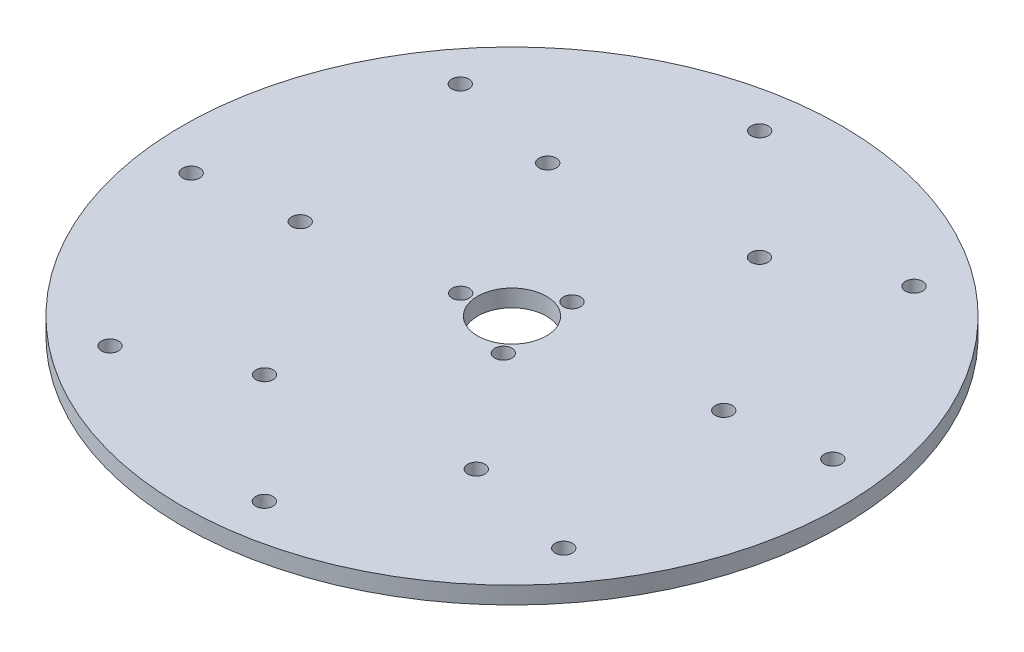
ISO-10303-21;
HEADER;
FILE_DESCRIPTION(('STEP AP214'),'2;1');
FILE_NAME('part.step','',(''),(''),'','','');
FILE_SCHEMA(('AUTOMOTIVE_DESIGN { 1 0 10303 214 1 1 1 1 }'));
ENDSEC;
DATA;
#1=APPLICATION_CONTEXT('core data for automotive mechanical design processes');
#2=APPLICATION_PROTOCOL_DEFINITION('international standard','automotive_design',2000,#1);
#3=PRODUCT_CONTEXT('',#1,'mechanical');
#4=PRODUCT('Part','Part','',(#3));
#5=PRODUCT_RELATED_PRODUCT_CATEGORY('part','',(#4));
#6=PRODUCT_DEFINITION_FORMATION('','',#4);
#7=PRODUCT_DEFINITION_CONTEXT('part definition',#1,'design');
#8=PRODUCT_DEFINITION('design','',#6,#7);
#9=PRODUCT_DEFINITION_SHAPE('','',#8);
#10=(LENGTH_UNIT() NAMED_UNIT(*) SI_UNIT(.MILLI.,.METRE.));
#11=(NAMED_UNIT(*) PLANE_ANGLE_UNIT() SI_UNIT($,.RADIAN.));
#12=(NAMED_UNIT(*) SI_UNIT($,.STERADIAN.) SOLID_ANGLE_UNIT());
#13=UNCERTAINTY_MEASURE_WITH_UNIT(LENGTH_MEASURE(1.E-05),#10,'distance_accuracy_value','');
#14=(GEOMETRIC_REPRESENTATION_CONTEXT(3) GLOBAL_UNCERTAINTY_ASSIGNED_CONTEXT((#13)) GLOBAL_UNIT_ASSIGNED_CONTEXT((#10,
#11,#12)) REPRESENTATION_CONTEXT('',''));
#15=CARTESIAN_POINT('',(0.,0.,0.));
#16=DIRECTION('',(0.,0.,1.));
#17=DIRECTION('',(1.,0.,0.));
#18=AXIS2_PLACEMENT_3D('',#15,#16,#17);
#19=CARTESIAN_POINT('',(0.,-97.,-2.63280363448266E-13));
#20=DIRECTION('',(0.,1.,0.));
#21=DIRECTION('',(0.991821591033947,0.,-0.127632016198486));
#22=AXIS2_PLACEMENT_3D('',#19,#20,#21);
#23=CYLINDRICAL_SURFACE('',#22,57.5);
#24=CARTESIAN_POINT('',(0.,-98.,-2.62205945253459E-13));
#25=DIRECTION('',(0.,-1.,0.));
#26=DIRECTION('',(-0.991821591033947,0.,0.127632016198486));
#27=AXIS2_PLACEMENT_3D('',#24,#25,#26);
#28=CIRCLE('',#27,57.5);
#29=CARTESIAN_POINT('',(-7.33884093141287,-98.0000000000001,-57.0297414844522));
#30=VERTEX_POINT('',#29);
#31=EDGE_CURVE('E56',#30,#30,#28,.T.);
#32=ORIENTED_EDGE('',*,*,#31,.F.);
#33=EDGE_LOOP('',(#32));
#34=FACE_BOUND('',#33,.T.);
#35=CARTESIAN_POINT('',(0.,-95.,-2.65429199837879E-13));
#36=DIRECTION('',(0.,-1.,0.));
#37=DIRECTION('',(-0.127632016198486,0.,-0.991821591033947));
#38=AXIS2_PLACEMENT_3D('',#35,#36,#37);
#39=CIRCLE('',#38,57.5);
#40=CARTESIAN_POINT('',(-7.33884093141286,-95.0000000000001,-57.0297414844522));
#41=VERTEX_POINT('',#40);
#42=EDGE_CURVE('E11',#41,#41,#39,.T.);
#43=ORIENTED_EDGE('',*,*,#42,.T.);
#44=EDGE_LOOP('',(#43));
#45=FACE_BOUND('',#44,.T.);
#46=ADVANCED_FACE('F46',(#34,#45),#23,.T.);
#47=CARTESIAN_POINT('',(0.,-98.,-2.62205945253459E-13));
#48=DIRECTION('',(0.,-1.,0.));
#49=DIRECTION('',(-0.127632016198486,0.,-0.991821591033947));
#50=AXIS2_PLACEMENT_3D('',#47,#48,#49);
#51=PLANE('',#50);
#52=CARTESIAN_POINT('',(3.08302581722295,-98.,-7.38206961565259));
#53=DIRECTION('',(0.,1.,0.));
#54=DIRECTION('',(0.991821591033947,0.,-0.127632016198486));
#55=AXIS2_PLACEMENT_3D('',#52,#53,#54);
#56=CIRCLE('',#55,1.5);
#57=CARTESIAN_POINT('',(4.57075820377387,-98.,-7.57351763995032));
#58=VERTEX_POINT('',#57);
#59=EDGE_CURVE('E203',#58,#58,#56,.T.);
#60=ORIENTED_EDGE('',*,*,#59,.T.);
#61=EDGE_LOOP('',(#60));
#62=FACE_BOUND('',#61,.T.);
#63=CARTESIAN_POINT('',(4.85154691104881,-98.,6.36101348606417));
#64=DIRECTION('',(0.,1.,0.));
#65=DIRECTION('',(0.991821591033947,0.,-0.127632016198486));
#66=AXIS2_PLACEMENT_3D('',#63,#64,#65);
#67=CIRCLE('',#66,1.5);
#68=CARTESIAN_POINT('',(6.33927929759974,-98.,6.16956546176645));
#69=VERTEX_POINT('',#68);
#70=EDGE_CURVE('E335',#69,#69,#67,.T.);
#71=ORIENTED_EDGE('',*,*,#70,.T.);
#72=EDGE_LOOP('',(#71));
#73=FACE_BOUND('',#72,.T.);
#74=CARTESIAN_POINT('',(-7.93457272827148,-98.,1.02105612958763));
#75=DIRECTION('',(0.,1.,0.));
#76=DIRECTION('',(0.991821591033947,0.,-0.127632016198486));
#77=AXIS2_PLACEMENT_3D('',#74,#75,#76);
#78=CIRCLE('',#77,1.5);
#79=CARTESIAN_POINT('',(-6.44684034172056,-98.,0.829608105289899));
#80=VERTEX_POINT('',#79);
#81=EDGE_CURVE('E339',#80,#80,#78,.T.);
#82=ORIENTED_EDGE('',*,*,#81,.T.);
#83=EDGE_LOOP('',(#82));
#84=FACE_BOUND('',#83,.T.);
#85=CARTESIAN_POINT('',(32.7301125041203,-98.0000000000001,-4.21185653455031));
#86=DIRECTION('',(0.,-1.,0.));
#87=DIRECTION('',(-0.991821591033947,0.,0.127632016198486));
#88=AXIS2_PLACEMENT_3D('',#85,#86,#87);
#89=CIRCLE('',#88,1.5);
#90=CARTESIAN_POINT('',(31.2423801175694,-98.0000000000001,-4.02040851025258));
#91=VERTEX_POINT('',#90);
#92=EDGE_CURVE('E195',#91,#91,#89,.T.);
#93=ORIENTED_EDGE('',*,*,#92,.F.);
#94=EDGE_LOOP('',(#93));
#95=FACE_BOUND('',#94,.T.);
#96=CARTESIAN_POINT('',(0.,-98.,-2.62205945253459E-13));
#97=DIRECTION('',(0.,-1.,0.));
#98=DIRECTION('',(-0.991821591033947,0.,0.127632016198486));
#99=AXIS2_PLACEMENT_3D('',#96,#97,#98);
#100=CIRCLE('',#99,6.);
#101=CARTESIAN_POINT('',(-5.95092954620358,-98.,0.765792097190656));
#102=VERTEX_POINT('',#101);
#103=EDGE_CURVE('E204',#102,#102,#100,.T.);
#104=ORIENTED_EDGE('',*,*,#103,.F.);
#105=EDGE_LOOP('',(#104));
#106=FACE_BOUND('',#105,.T.);
#107=CARTESIAN_POINT('',(20.012631008076,-98.,26.2391806300156));
#108=DIRECTION('',(0.,-1.,0.));
#109=DIRECTION('',(-0.991821591033947,0.,0.127632016198486));
#110=AXIS2_PLACEMENT_3D('',#107,#108,#109);
#111=CIRCLE('',#110,1.5);
#112=CARTESIAN_POINT('',(18.5248986215251,-98.,26.4306286543133));
#113=VERTEX_POINT('',#112);
#114=EDGE_CURVE('E207',#113,#113,#111,.T.);
#115=ORIENTED_EDGE('',*,*,#114,.F.);
#116=EDGE_LOOP('',(#115));
#117=FACE_BOUND('',#116,.T.);
#118=CARTESIAN_POINT('',(-12.7174814960442,-98.,30.4510371645656));
#119=DIRECTION('',(0.,-1.,0.));
#120=DIRECTION('',(-0.991821591033947,0.,0.127632016198486));
#121=AXIS2_PLACEMENT_3D('',#118,#119,#120);
#122=CIRCLE('',#121,1.5);
#123=CARTESIAN_POINT('',(-14.2052138825951,-98.,30.6424851888633));
#124=VERTEX_POINT('',#123);
#125=EDGE_CURVE('E216',#124,#124,#122,.T.);
#126=ORIENTED_EDGE('',*,*,#125,.F.);
#127=EDGE_LOOP('',(#126));
#128=FACE_BOUND('',#127,.T.);
#129=CARTESIAN_POINT('',(-32.7301125041201,-98.,4.21185653454978));
#130=DIRECTION('',(0.,-1.,0.));
#131=DIRECTION('',(-0.991821591033947,0.,0.127632016198486));
#132=AXIS2_PLACEMENT_3D('',#129,#130,#131);
#133=CIRCLE('',#132,1.5);
#134=CARTESIAN_POINT('',(-34.2178448906711,-98.,4.40330455884751));
#135=VERTEX_POINT('',#134);
#136=EDGE_CURVE('E228',#135,#135,#133,.T.);
#137=ORIENTED_EDGE('',*,*,#136,.F.);
#138=EDGE_LOOP('',(#137));
#139=FACE_BOUND('',#138,.T.);
#140=CARTESIAN_POINT('',(-20.0126310080758,-98.,-26.2391806300161));
#141=DIRECTION('',(0.,-1.,0.));
#142=DIRECTION('',(-0.991821591033947,0.,0.127632016198486));
#143=AXIS2_PLACEMENT_3D('',#140,#141,#142);
#144=CIRCLE('',#143,1.50000000000015);
#145=CARTESIAN_POINT('',(-21.5003633946269,-98.,-26.0477326057183));
#146=VERTEX_POINT('',#145);
#147=EDGE_CURVE('E224',#146,#146,#144,.T.);
#148=ORIENTED_EDGE('',*,*,#147,.F.);
#149=EDGE_LOOP('',(#148));
#150=FACE_BOUND('',#149,.T.);
#151=CARTESIAN_POINT('',(12.7174814960444,-98.0000000000001,-30.4510371645661));
#152=DIRECTION('',(0.,-1.,0.));
#153=DIRECTION('',(-0.991821591033947,0.,0.127632016198486));
#154=AXIS2_PLACEMENT_3D('',#151,#152,#153);
#155=CIRCLE('',#154,1.50000000000008);
#156=CARTESIAN_POINT('',(11.2297491094934,-98.0000000000001,-30.2595891402684));
#157=VERTEX_POINT('',#156);
#158=EDGE_CURVE('E220',#157,#157,#155,.T.);
#159=ORIENTED_EDGE('',*,*,#158,.F.);
#160=EDGE_LOOP('',(#159));
#161=FACE_BOUND('',#160,.T.);
#162=CARTESIAN_POINT('',(30.5537154298437,-98.0000000000001,-39.5786618448899));
#163=DIRECTION('',(0.,-1.,0.));
#164=DIRECTION('',(-0.991821591033947,0.,0.127632016198486));
#165=AXIS2_PLACEMENT_3D('',#162,#163,#164);
#166=CIRCLE('',#165,1.50000000000008);
#167=CARTESIAN_POINT('',(29.0659830432927,-98.0000000000001,-39.3872138205922));
#168=VERTEX_POINT('',#167);
#169=EDGE_CURVE('E153',#168,#168,#166,.T.);
#170=ORIENTED_EDGE('',*,*,#169,.F.);
#171=EDGE_LOOP('',(#170));
#172=FACE_BOUND('',#171,.T.);
#173=CARTESIAN_POINT('',(-6.3816008099242,-98.0000000000001,-49.5910795516975));
#174=DIRECTION('',(0.,-1.,0.));
#175=DIRECTION('',(-0.991821591033947,0.,0.127632016198486));
#176=AXIS2_PLACEMENT_3D('',#173,#174,#175);
#177=CIRCLE('',#176,1.50000000000017);
#178=CARTESIAN_POINT('',(-7.86933319647529,-98.0000000000001,-49.3996315273997));
#179=VERTEX_POINT('',#178);
#180=EDGE_CURVE('E158',#179,#179,#177,.T.);
#181=ORIENTED_EDGE('',*,*,#180,.F.);
#182=EDGE_LOOP('',(#181));
#183=FACE_BOUND('',#182,.T.);
#184=CARTESIAN_POINT('',(-39.5786618448896,-98.,-30.5537154298439));
#185=DIRECTION('',(0.,-1.,0.));
#186=DIRECTION('',(-0.991821591033947,0.,0.127632016198486));
#187=AXIS2_PLACEMENT_3D('',#184,#185,#186);
#188=CIRCLE('',#187,1.50000000000027);
#189=CARTESIAN_POINT('',(-41.0663942314407,-98.,-30.3622674055461));
#190=VERTEX_POINT('',#189);
#191=EDGE_CURVE('E171',#190,#190,#188,.T.);
#192=ORIENTED_EDGE('',*,*,#191,.F.);
#193=EDGE_LOOP('',(#192));
#194=FACE_BOUND('',#193,.T.);
#195=CARTESIAN_POINT('',(-49.5910795516971,-98.,6.38160080992403));
#196=DIRECTION('',(0.,-1.,0.));
#197=DIRECTION('',(-0.991821591033947,0.,0.127632016198486));
#198=AXIS2_PLACEMENT_3D('',#195,#196,#197);
#199=CIRCLE('',#198,1.50000000000035);
#200=CARTESIAN_POINT('',(-51.0788119382484,-98.,6.5730488342218));
#201=VERTEX_POINT('',#200);
#202=EDGE_CURVE('E175',#201,#201,#199,.T.);
#203=ORIENTED_EDGE('',*,*,#202,.F.);
#204=EDGE_LOOP('',(#203));
#205=FACE_BOUND('',#204,.T.);
#206=CARTESIAN_POINT('',(-30.5537154298435,-98.,39.5786618448894));
#207=DIRECTION('',(0.,-1.,0.));
#208=DIRECTION('',(-0.991821591033947,0.,0.127632016198486));
#209=AXIS2_PLACEMENT_3D('',#206,#207,#208);
#210=CIRCLE('',#209,1.50000000000043);
#211=CARTESIAN_POINT('',(-32.0414478163949,-98.,39.7701098691872));
#212=VERTEX_POINT('',#211);
#213=EDGE_CURVE('E178',#212,#212,#210,.T.);
#214=ORIENTED_EDGE('',*,*,#213,.F.);
#215=EDGE_LOOP('',(#214));
#216=FACE_BOUND('',#215,.T.);
#217=CARTESIAN_POINT('',(6.38160080992439,-98.,49.591079551697));
#218=DIRECTION('',(0.,-1.,0.));
#219=DIRECTION('',(-0.991821591033947,0.,0.127632016198486));
#220=AXIS2_PLACEMENT_3D('',#217,#218,#219);
#221=CIRCLE('',#220,1.50000000000051);
#222=CARTESIAN_POINT('',(4.89386842337296,-98.,49.7825275759947));
#223=VERTEX_POINT('',#222);
#224=EDGE_CURVE('E181',#223,#223,#221,.T.);
#225=ORIENTED_EDGE('',*,*,#224,.F.);
#226=EDGE_LOOP('',(#225));
#227=FACE_BOUND('',#226,.T.);
#228=CARTESIAN_POINT('',(39.5786618448898,-98.,30.5537154298433));
#229=DIRECTION('',(0.,-1.,0.));
#230=DIRECTION('',(-0.991821591033947,0.,0.127632016198486));
#231=AXIS2_PLACEMENT_3D('',#228,#229,#230);
#232=CIRCLE('',#231,1.50000000000059);
#233=CARTESIAN_POINT('',(38.0909294583383,-98.,30.7451634541411));
#234=VERTEX_POINT('',#233);
#235=EDGE_CURVE('E185',#234,#234,#232,.T.);
#236=ORIENTED_EDGE('',*,*,#235,.F.);
#237=EDGE_LOOP('',(#236));
#238=FACE_BOUND('',#237,.T.);
#239=CARTESIAN_POINT('',(49.5910795516973,-98.0000000000001,-6.38160080992456));
#240=DIRECTION('',(0.,-1.,0.));
#241=DIRECTION('',(-0.991821591033947,0.,0.127632016198486));
#242=AXIS2_PLACEMENT_3D('',#239,#240,#241);
#243=CIRCLE('',#242,1.5);
#244=CARTESIAN_POINT('',(48.1033471651464,-98.0000000000001,-6.19015278562683));
#245=VERTEX_POINT('',#244);
#246=EDGE_CURVE('E188',#245,#245,#243,.T.);
#247=ORIENTED_EDGE('',*,*,#246,.F.);
#248=EDGE_LOOP('',(#247));
#249=FACE_BOUND('',#248,.T.);
#250=ORIENTED_EDGE('',*,*,#31,.T.);
#251=EDGE_LOOP('',(#250));
#252=FACE_BOUND('',#251,.T.);
#253=ADVANCED_FACE('F48',(#62,#73,#84,#95,#106,#117,#128,#139,#150,#161,#172,#183,#194,#205,
#216,#227,#238,#249,#252),#51,.T.);
#254=CARTESIAN_POINT('',(0.,-95.,-2.65429199837879E-13));
#255=DIRECTION('',(0.,-1.,0.));
#256=DIRECTION('',(-0.127632016198486,0.,-0.991821591033947));
#257=AXIS2_PLACEMENT_3D('',#254,#255,#256);
#258=PLANE('',#257);
#259=CARTESIAN_POINT('',(3.08302581722296,-95.,-7.3820696156526));
#260=DIRECTION('',(0.,-1.,0.));
#261=DIRECTION('',(-0.991821591033947,0.,0.127632016198486));
#262=AXIS2_PLACEMENT_3D('',#259,#260,#261);
#263=CIRCLE('',#262,1.5);
#264=CARTESIAN_POINT('',(1.59529343067204,-95.,-7.19062159135487));
#265=VERTEX_POINT('',#264);
#266=EDGE_CURVE('E50',#265,#265,#263,.T.);
#267=ORIENTED_EDGE('',*,*,#266,.T.);
#268=EDGE_LOOP('',(#267));
#269=FACE_BOUND('',#268,.T.);
#270=CARTESIAN_POINT('',(4.85154691104882,-95.,6.36101348606417));
#271=DIRECTION('',(0.,-1.,0.));
#272=DIRECTION('',(-0.991821591033947,0.,0.127632016198486));
#273=AXIS2_PLACEMENT_3D('',#270,#271,#272);
#274=CIRCLE('',#273,1.5);
#275=CARTESIAN_POINT('',(3.3638145244979,-95.,6.5524615103619));
#276=VERTEX_POINT('',#275);
#277=EDGE_CURVE('E88',#276,#276,#274,.T.);
#278=ORIENTED_EDGE('',*,*,#277,.T.);
#279=EDGE_LOOP('',(#278));
#280=FACE_BOUND('',#279,.T.);
#281=CARTESIAN_POINT('',(-7.93457272827147,-95.,1.02105612958762));
#282=DIRECTION('',(0.,-1.,0.));
#283=DIRECTION('',(-0.991821591033947,0.,0.127632016198486));
#284=AXIS2_PLACEMENT_3D('',#281,#282,#283);
#285=CIRCLE('',#284,1.5);
#286=CARTESIAN_POINT('',(-9.42230511482239,-95.,1.21250415388535));
#287=VERTEX_POINT('',#286);
#288=EDGE_CURVE('E92',#287,#287,#285,.T.);
#289=ORIENTED_EDGE('',*,*,#288,.T.);
#290=EDGE_LOOP('',(#289));
#291=FACE_BOUND('',#290,.T.);
#292=CARTESIAN_POINT('',(32.7301125041203,-95.0000000000001,-4.21185653455031));
#293=DIRECTION('',(0.,-1.,0.));
#294=DIRECTION('',(-0.991821591033947,0.,0.127632016198486));
#295=AXIS2_PLACEMENT_3D('',#292,#293,#294);
#296=CIRCLE('',#295,1.5);
#297=CARTESIAN_POINT('',(31.2423801175694,-95.0000000000001,-4.02040851025258));
#298=VERTEX_POINT('',#297);
#299=EDGE_CURVE('E96',#298,#298,#296,.T.);
#300=ORIENTED_EDGE('',*,*,#299,.T.);
#301=EDGE_LOOP('',(#300));
#302=FACE_BOUND('',#301,.T.);
#303=CARTESIAN_POINT('',(0.,-95.,-2.65429199837879E-13));
#304=DIRECTION('',(0.,-1.,0.));
#305=DIRECTION('',(-0.991821591033947,0.,0.127632016198486));
#306=AXIS2_PLACEMENT_3D('',#303,#304,#305);
#307=CIRCLE('',#306,6.);
#308=CARTESIAN_POINT('',(-5.95092954620358,-95.,0.765792097190653));
#309=VERTEX_POINT('',#308);
#310=EDGE_CURVE('E100',#309,#309,#307,.T.);
#311=ORIENTED_EDGE('',*,*,#310,.T.);
#312=EDGE_LOOP('',(#311));
#313=FACE_BOUND('',#312,.T.);
#314=CARTESIAN_POINT('',(20.012631008076,-95.,26.2391806300156));
#315=DIRECTION('',(0.,-1.,0.));
#316=DIRECTION('',(-0.991821591033947,0.,0.127632016198486));
#317=AXIS2_PLACEMENT_3D('',#314,#315,#316);
#318=CIRCLE('',#317,1.5);
#319=CARTESIAN_POINT('',(18.5248986215251,-95.,26.4306286543133));
#320=VERTEX_POINT('',#319);
#321=EDGE_CURVE('E104',#320,#320,#318,.T.);
#322=ORIENTED_EDGE('',*,*,#321,.T.);
#323=EDGE_LOOP('',(#322));
#324=FACE_BOUND('',#323,.T.);
#325=CARTESIAN_POINT('',(-12.7174814960442,-95.,30.4510371645656));
#326=DIRECTION('',(0.,-1.,0.));
#327=DIRECTION('',(-0.991821591033947,0.,0.127632016198486));
#328=AXIS2_PLACEMENT_3D('',#325,#326,#327);
#329=CIRCLE('',#328,1.5);
#330=CARTESIAN_POINT('',(-14.2052138825951,-95.,30.6424851888633));
#331=VERTEX_POINT('',#330);
#332=EDGE_CURVE('E108',#331,#331,#329,.T.);
#333=ORIENTED_EDGE('',*,*,#332,.T.);
#334=EDGE_LOOP('',(#333));
#335=FACE_BOUND('',#334,.T.);
#336=CARTESIAN_POINT('',(-32.7301125041201,-95.,4.21185653454978));
#337=DIRECTION('',(0.,-1.,0.));
#338=DIRECTION('',(-0.991821591033947,0.,0.127632016198486));
#339=AXIS2_PLACEMENT_3D('',#336,#337,#338);
#340=CIRCLE('',#339,1.5);
#341=CARTESIAN_POINT('',(-34.2178448906711,-95.,4.40330455884751));
#342=VERTEX_POINT('',#341);
#343=EDGE_CURVE('E112',#342,#342,#340,.T.);
#344=ORIENTED_EDGE('',*,*,#343,.T.);
#345=EDGE_LOOP('',(#344));
#346=FACE_BOUND('',#345,.T.);
#347=CARTESIAN_POINT('',(-20.0126310080758,-95.,-26.2391806300161));
#348=DIRECTION('',(0.,-1.,0.));
#349=DIRECTION('',(-0.991821591033947,0.,0.127632016198486));
#350=AXIS2_PLACEMENT_3D('',#347,#348,#349);
#351=CIRCLE('',#350,1.50000000000015);
#352=CARTESIAN_POINT('',(-21.5003633946269,-95.,-26.0477326057183));
#353=VERTEX_POINT('',#352);
#354=EDGE_CURVE('E116',#353,#353,#351,.T.);
#355=ORIENTED_EDGE('',*,*,#354,.T.);
#356=EDGE_LOOP('',(#355));
#357=FACE_BOUND('',#356,.T.);
#358=CARTESIAN_POINT('',(12.7174814960444,-95.0000000000001,-30.4510371645661));
#359=DIRECTION('',(0.,-1.,0.));
#360=DIRECTION('',(-0.991821591033947,0.,0.127632016198486));
#361=AXIS2_PLACEMENT_3D('',#358,#359,#360);
#362=CIRCLE('',#361,1.50000000000008);
#363=CARTESIAN_POINT('',(11.2297491094934,-95.0000000000001,-30.2595891402684));
#364=VERTEX_POINT('',#363);
#365=EDGE_CURVE('E120',#364,#364,#362,.T.);
#366=ORIENTED_EDGE('',*,*,#365,.T.);
#367=EDGE_LOOP('',(#366));
#368=FACE_BOUND('',#367,.T.);
#369=CARTESIAN_POINT('',(30.5537154298437,-95.0000000000001,-39.5786618448899));
#370=DIRECTION('',(0.,-1.,0.));
#371=DIRECTION('',(-0.991821591033947,0.,0.127632016198486));
#372=AXIS2_PLACEMENT_3D('',#369,#370,#371);
#373=CIRCLE('',#372,1.50000000000008);
#374=CARTESIAN_POINT('',(29.0659830432927,-95.0000000000001,-39.3872138205922));
#375=VERTEX_POINT('',#374);
#376=EDGE_CURVE('E124',#375,#375,#373,.T.);
#377=ORIENTED_EDGE('',*,*,#376,.T.);
#378=EDGE_LOOP('',(#377));
#379=FACE_BOUND('',#378,.T.);
#380=CARTESIAN_POINT('',(-6.3816008099242,-95.0000000000001,-49.5910795516975));
#381=DIRECTION('',(0.,-1.,0.));
#382=DIRECTION('',(-0.991821591033947,0.,0.127632016198486));
#383=AXIS2_PLACEMENT_3D('',#380,#381,#382);
#384=CIRCLE('',#383,1.50000000000017);
#385=CARTESIAN_POINT('',(-7.86933319647529,-95.0000000000001,-49.3996315273997));
#386=VERTEX_POINT('',#385);
#387=EDGE_CURVE('E128',#386,#386,#384,.T.);
#388=ORIENTED_EDGE('',*,*,#387,.T.);
#389=EDGE_LOOP('',(#388));
#390=FACE_BOUND('',#389,.T.);
#391=CARTESIAN_POINT('',(-39.5786618448896,-95.,-30.5537154298439));
#392=DIRECTION('',(0.,-1.,0.));
#393=DIRECTION('',(-0.991821591033947,0.,0.127632016198486));
#394=AXIS2_PLACEMENT_3D('',#391,#392,#393);
#395=CIRCLE('',#394,1.50000000000027);
#396=CARTESIAN_POINT('',(-41.0663942314407,-95.,-30.3622674055461));
#397=VERTEX_POINT('',#396);
#398=EDGE_CURVE('E132',#397,#397,#395,.T.);
#399=ORIENTED_EDGE('',*,*,#398,.T.);
#400=EDGE_LOOP('',(#399));
#401=FACE_BOUND('',#400,.T.);
#402=CARTESIAN_POINT('',(-49.5910795516971,-95.,6.38160080992403));
#403=DIRECTION('',(0.,-1.,0.));
#404=DIRECTION('',(-0.991821591033947,0.,0.127632016198486));
#405=AXIS2_PLACEMENT_3D('',#402,#403,#404);
#406=CIRCLE('',#405,1.50000000000035);
#407=CARTESIAN_POINT('',(-51.0788119382484,-95.,6.5730488342218));
#408=VERTEX_POINT('',#407);
#409=EDGE_CURVE('E136',#408,#408,#406,.T.);
#410=ORIENTED_EDGE('',*,*,#409,.T.);
#411=EDGE_LOOP('',(#410));
#412=FACE_BOUND('',#411,.T.);
#413=CARTESIAN_POINT('',(-30.5537154298435,-95.,39.5786618448894));
#414=DIRECTION('',(0.,-1.,0.));
#415=DIRECTION('',(-0.991821591033947,0.,0.127632016198486));
#416=AXIS2_PLACEMENT_3D('',#413,#414,#415);
#417=CIRCLE('',#416,1.50000000000043);
#418=CARTESIAN_POINT('',(-32.0414478163949,-95.,39.7701098691872));
#419=VERTEX_POINT('',#418);
#420=EDGE_CURVE('E140',#419,#419,#417,.T.);
#421=ORIENTED_EDGE('',*,*,#420,.T.);
#422=EDGE_LOOP('',(#421));
#423=FACE_BOUND('',#422,.T.);
#424=CARTESIAN_POINT('',(6.38160080992439,-95.,49.591079551697));
#425=DIRECTION('',(0.,-1.,0.));
#426=DIRECTION('',(-0.991821591033947,0.,0.127632016198486));
#427=AXIS2_PLACEMENT_3D('',#424,#425,#426);
#428=CIRCLE('',#427,1.50000000000051);
#429=CARTESIAN_POINT('',(4.89386842337296,-95.,49.7825275759947));
#430=VERTEX_POINT('',#429);
#431=EDGE_CURVE('E144',#430,#430,#428,.T.);
#432=ORIENTED_EDGE('',*,*,#431,.T.);
#433=EDGE_LOOP('',(#432));
#434=FACE_BOUND('',#433,.T.);
#435=CARTESIAN_POINT('',(39.5786618448898,-95.,30.5537154298433));
#436=DIRECTION('',(0.,-1.,0.));
#437=DIRECTION('',(-0.991821591033947,0.,0.127632016198486));
#438=AXIS2_PLACEMENT_3D('',#435,#436,#437);
#439=CIRCLE('',#438,1.50000000000059);
#440=CARTESIAN_POINT('',(38.0909294583383,-95.,30.7451634541411));
#441=VERTEX_POINT('',#440);
#442=EDGE_CURVE('E148',#441,#441,#439,.T.);
#443=ORIENTED_EDGE('',*,*,#442,.T.);
#444=EDGE_LOOP('',(#443));
#445=FACE_BOUND('',#444,.T.);
#446=CARTESIAN_POINT('',(49.5910795516973,-95.0000000000001,-6.38160080992457));
#447=DIRECTION('',(0.,-1.,0.));
#448=DIRECTION('',(-0.991821591033947,0.,0.127632016198486));
#449=AXIS2_PLACEMENT_3D('',#446,#447,#448);
#450=CIRCLE('',#449,1.5);
#451=CARTESIAN_POINT('',(48.1033471651464,-95.0000000000001,-6.19015278562684));
#452=VERTEX_POINT('',#451);
#453=EDGE_CURVE('E151',#452,#452,#450,.T.);
#454=ORIENTED_EDGE('',*,*,#453,.T.);
#455=EDGE_LOOP('',(#454));
#456=FACE_BOUND('',#455,.T.);
#457=ORIENTED_EDGE('',*,*,#42,.F.);
#458=EDGE_LOOP('',(#457));
#459=FACE_BOUND('',#458,.T.);
#460=ADVANCED_FACE('F64',(#269,#280,#291,#302,#313,#324,#335,#346,#357,#368,#379,#390,#401,#412,
#423,#434,#445,#456,#459),#258,.F.);
#461=CARTESIAN_POINT('',(49.5910795516973,-92.0000000000001,-6.38160080992457));
#462=DIRECTION('',(0.,-1.,0.));
#463=DIRECTION('',(-0.991821591033947,0.,0.127632016198486));
#464=AXIS2_PLACEMENT_3D('',#461,#462,#463);
#465=CYLINDRICAL_SURFACE('',#464,1.5);
#466=ORIENTED_EDGE('',*,*,#246,.T.);
#467=EDGE_LOOP('',(#466));
#468=FACE_BOUND('',#467,.T.);
#469=ORIENTED_EDGE('',*,*,#453,.F.);
#470=EDGE_LOOP('',(#469));
#471=FACE_BOUND('',#470,.T.);
#472=ADVANCED_FACE('F73',(#468,#471),#465,.F.);
#473=CARTESIAN_POINT('',(39.5786618448898,-92.,30.5537154298433));
#474=DIRECTION('',(0.,-1.,0.));
#475=DIRECTION('',(-0.991821591033947,0.,0.127632016198486));
#476=AXIS2_PLACEMENT_3D('',#473,#474,#475);
#477=CYLINDRICAL_SURFACE('',#476,1.50000000000059);
#478=ORIENTED_EDGE('',*,*,#235,.T.);
#479=EDGE_LOOP('',(#478));
#480=FACE_BOUND('',#479,.T.);
#481=ORIENTED_EDGE('',*,*,#442,.F.);
#482=EDGE_LOOP('',(#481));
#483=FACE_BOUND('',#482,.T.);
#484=ADVANCED_FACE('F80',(#480,#483),#477,.F.);
#485=CARTESIAN_POINT('',(6.38160080992439,-92.,49.591079551697));
#486=DIRECTION('',(0.,-1.,0.));
#487=DIRECTION('',(-0.991821591033947,0.,0.127632016198486));
#488=AXIS2_PLACEMENT_3D('',#485,#486,#487);
#489=CYLINDRICAL_SURFACE('',#488,1.50000000000051);
#490=ORIENTED_EDGE('',*,*,#224,.T.);
#491=EDGE_LOOP('',(#490));
#492=FACE_BOUND('',#491,.T.);
#493=ORIENTED_EDGE('',*,*,#431,.F.);
#494=EDGE_LOOP('',(#493));
#495=FACE_BOUND('',#494,.T.);
#496=ADVANCED_FACE('F267',(#492,#495),#489,.F.);
#497=CARTESIAN_POINT('',(-30.5537154298435,-92.,39.5786618448894));
#498=DIRECTION('',(0.,-1.,0.));
#499=DIRECTION('',(-0.991821591033947,0.,0.127632016198486));
#500=AXIS2_PLACEMENT_3D('',#497,#498,#499);
#501=CYLINDRICAL_SURFACE('',#500,1.50000000000043);
#502=ORIENTED_EDGE('',*,*,#213,.T.);
#503=EDGE_LOOP('',(#502));
#504=FACE_BOUND('',#503,.T.);
#505=ORIENTED_EDGE('',*,*,#420,.F.);
#506=EDGE_LOOP('',(#505));
#507=FACE_BOUND('',#506,.T.);
#508=ADVANCED_FACE('F271',(#504,#507),#501,.F.);
#509=CARTESIAN_POINT('',(-49.5910795516971,-92.,6.38160080992402));
#510=DIRECTION('',(0.,-1.,0.));
#511=DIRECTION('',(-0.991821591033947,0.,0.127632016198486));
#512=AXIS2_PLACEMENT_3D('',#509,#510,#511);
#513=CYLINDRICAL_SURFACE('',#512,1.50000000000035);
#514=ORIENTED_EDGE('',*,*,#202,.T.);
#515=EDGE_LOOP('',(#514));
#516=FACE_BOUND('',#515,.T.);
#517=ORIENTED_EDGE('',*,*,#409,.F.);
#518=EDGE_LOOP('',(#517));
#519=FACE_BOUND('',#518,.T.);
#520=ADVANCED_FACE('F277',(#516,#519),#513,.F.);
#521=CARTESIAN_POINT('',(-39.5786618448896,-92.,-30.5537154298439));
#522=DIRECTION('',(0.,-1.,0.));
#523=DIRECTION('',(-0.991821591033947,0.,0.127632016198486));
#524=AXIS2_PLACEMENT_3D('',#521,#522,#523);
#525=CYLINDRICAL_SURFACE('',#524,1.50000000000027);
#526=ORIENTED_EDGE('',*,*,#191,.T.);
#527=EDGE_LOOP('',(#526));
#528=FACE_BOUND('',#527,.T.);
#529=ORIENTED_EDGE('',*,*,#398,.F.);
#530=EDGE_LOOP('',(#529));
#531=FACE_BOUND('',#530,.T.);
#532=ADVANCED_FACE('F281',(#528,#531),#525,.F.);
#533=CARTESIAN_POINT('',(-6.38160080992419,-92.0000000000001,-49.5910795516975));
#534=DIRECTION('',(0.,-1.,0.));
#535=DIRECTION('',(-0.991821591033947,0.,0.127632016198486));
#536=AXIS2_PLACEMENT_3D('',#533,#534,#535);
#537=CYLINDRICAL_SURFACE('',#536,1.50000000000017);
#538=ORIENTED_EDGE('',*,*,#180,.T.);
#539=EDGE_LOOP('',(#538));
#540=FACE_BOUND('',#539,.T.);
#541=ORIENTED_EDGE('',*,*,#387,.F.);
#542=EDGE_LOOP('',(#541));
#543=FACE_BOUND('',#542,.T.);
#544=ADVANCED_FACE('F285',(#540,#543),#537,.F.);
#545=CARTESIAN_POINT('',(30.5537154298437,-92.0000000000001,-39.5786618448899));
#546=DIRECTION('',(0.,-1.,0.));
#547=DIRECTION('',(-0.991821591033947,0.,0.127632016198486));
#548=AXIS2_PLACEMENT_3D('',#545,#546,#547);
#549=CYLINDRICAL_SURFACE('',#548,1.50000000000008);
#550=ORIENTED_EDGE('',*,*,#169,.T.);
#551=EDGE_LOOP('',(#550));
#552=FACE_BOUND('',#551,.T.);
#553=ORIENTED_EDGE('',*,*,#376,.F.);
#554=EDGE_LOOP('',(#553));
#555=FACE_BOUND('',#554,.T.);
#556=ADVANCED_FACE('F289',(#552,#555),#549,.F.);
#557=CARTESIAN_POINT('',(12.7174814960444,-92.0000000000001,-30.4510371645661));
#558=DIRECTION('',(0.,-1.,0.));
#559=DIRECTION('',(-0.991821591033947,0.,0.127632016198486));
#560=AXIS2_PLACEMENT_3D('',#557,#558,#559);
#561=CYLINDRICAL_SURFACE('',#560,1.50000000000008);
#562=ORIENTED_EDGE('',*,*,#158,.T.);
#563=EDGE_LOOP('',(#562));
#564=FACE_BOUND('',#563,.T.);
#565=ORIENTED_EDGE('',*,*,#365,.F.);
#566=EDGE_LOOP('',(#565));
#567=FACE_BOUND('',#566,.T.);
#568=ADVANCED_FACE('F293',(#564,#567),#561,.F.);
#569=CARTESIAN_POINT('',(-20.0126310080758,-92.,-26.2391806300161));
#570=DIRECTION('',(0.,-1.,0.));
#571=DIRECTION('',(-0.991821591033947,0.,0.127632016198486));
#572=AXIS2_PLACEMENT_3D('',#569,#570,#571);
#573=CYLINDRICAL_SURFACE('',#572,1.50000000000015);
#574=ORIENTED_EDGE('',*,*,#147,.T.);
#575=EDGE_LOOP('',(#574));
#576=FACE_BOUND('',#575,.T.);
#577=ORIENTED_EDGE('',*,*,#354,.F.);
#578=EDGE_LOOP('',(#577));
#579=FACE_BOUND('',#578,.T.);
#580=ADVANCED_FACE('F301',(#576,#579),#573,.F.);
#581=CARTESIAN_POINT('',(-32.7301125041201,-92.,4.21185653454978));
#582=DIRECTION('',(0.,-1.,0.));
#583=DIRECTION('',(-0.991821591033947,0.,0.127632016198486));
#584=AXIS2_PLACEMENT_3D('',#581,#582,#583);
#585=CYLINDRICAL_SURFACE('',#584,1.5);
#586=ORIENTED_EDGE('',*,*,#136,.T.);
#587=EDGE_LOOP('',(#586));
#588=FACE_BOUND('',#587,.T.);
#589=ORIENTED_EDGE('',*,*,#343,.F.);
#590=EDGE_LOOP('',(#589));
#591=FACE_BOUND('',#590,.T.);
#592=ADVANCED_FACE('F298',(#588,#591),#585,.F.);
#593=CARTESIAN_POINT('',(-12.7174814960442,-92.,30.4510371645656));
#594=DIRECTION('',(0.,-1.,0.));
#595=DIRECTION('',(-0.991821591033947,0.,0.127632016198486));
#596=AXIS2_PLACEMENT_3D('',#593,#594,#595);
#597=CYLINDRICAL_SURFACE('',#596,1.5);
#598=ORIENTED_EDGE('',*,*,#125,.T.);
#599=EDGE_LOOP('',(#598));
#600=FACE_BOUND('',#599,.T.);
#601=ORIENTED_EDGE('',*,*,#332,.F.);
#602=EDGE_LOOP('',(#601));
#603=FACE_BOUND('',#602,.T.);
#604=ADVANCED_FACE('F238',(#600,#603),#597,.F.);
#605=CARTESIAN_POINT('',(20.012631008076,-92.,26.2391806300156));
#606=DIRECTION('',(0.,-1.,0.));
#607=DIRECTION('',(-0.991821591033947,0.,0.127632016198486));
#608=AXIS2_PLACEMENT_3D('',#605,#606,#607);
#609=CYLINDRICAL_SURFACE('',#608,1.5);
#610=ORIENTED_EDGE('',*,*,#114,.T.);
#611=EDGE_LOOP('',(#610));
#612=FACE_BOUND('',#611,.T.);
#613=ORIENTED_EDGE('',*,*,#321,.F.);
#614=EDGE_LOOP('',(#613));
#615=FACE_BOUND('',#614,.T.);
#616=ADVANCED_FACE('F297',(#612,#615),#609,.F.);
#617=CARTESIAN_POINT('',(1.02379162746304E-13,-92.,-2.68652454422299E-13));
#618=DIRECTION('',(0.,-1.,0.));
#619=DIRECTION('',(-0.991821591033947,0.,0.127632016198486));
#620=AXIS2_PLACEMENT_3D('',#617,#618,#619);
#621=CYLINDRICAL_SURFACE('',#620,6.);
#622=ORIENTED_EDGE('',*,*,#103,.T.);
#623=EDGE_LOOP('',(#622));
#624=FACE_BOUND('',#623,.T.);
#625=ORIENTED_EDGE('',*,*,#310,.F.);
#626=EDGE_LOOP('',(#625));
#627=FACE_BOUND('',#626,.T.);
#628=ADVANCED_FACE('F309',(#624,#627),#621,.F.);
#629=CARTESIAN_POINT('',(32.7301125041203,-92.0000000000001,-4.21185653455032));
#630=DIRECTION('',(0.,-1.,0.));
#631=DIRECTION('',(-0.991821591033947,0.,0.127632016198486));
#632=AXIS2_PLACEMENT_3D('',#629,#630,#631);
#633=CYLINDRICAL_SURFACE('',#632,1.5);
#634=ORIENTED_EDGE('',*,*,#92,.T.);
#635=EDGE_LOOP('',(#634));
#636=FACE_BOUND('',#635,.T.);
#637=ORIENTED_EDGE('',*,*,#299,.F.);
#638=EDGE_LOOP('',(#637));
#639=FACE_BOUND('',#638,.T.);
#640=ADVANCED_FACE('F312',(#636,#639),#633,.F.);
#641=CARTESIAN_POINT('',(-7.93457272827148,-98.,1.02105612958763));
#642=DIRECTION('',(0.,1.,0.));
#643=DIRECTION('',(0.991821591033947,0.,-0.127632016198486));
#644=AXIS2_PLACEMENT_3D('',#641,#642,#643);
#645=CYLINDRICAL_SURFACE('',#644,1.5);
#646=ORIENTED_EDGE('',*,*,#81,.F.);
#647=EDGE_LOOP('',(#646));
#648=FACE_BOUND('',#647,.T.);
#649=ORIENTED_EDGE('',*,*,#288,.F.);
#650=EDGE_LOOP('',(#649));
#651=FACE_BOUND('',#650,.T.);
#652=ADVANCED_FACE('F318',(#648,#651),#645,.F.);
#653=CARTESIAN_POINT('',(4.85154691104881,-98.,6.36101348606417));
#654=DIRECTION('',(0.,1.,0.));
#655=DIRECTION('',(0.991821591033947,0.,-0.127632016198486));
#656=AXIS2_PLACEMENT_3D('',#653,#654,#655);
#657=CYLINDRICAL_SURFACE('',#656,1.5);
#658=ORIENTED_EDGE('',*,*,#70,.F.);
#659=EDGE_LOOP('',(#658));
#660=FACE_BOUND('',#659,.T.);
#661=ORIENTED_EDGE('',*,*,#277,.F.);
#662=EDGE_LOOP('',(#661));
#663=FACE_BOUND('',#662,.T.);
#664=ADVANCED_FACE('F322',(#660,#663),#657,.F.);
#665=CARTESIAN_POINT('',(3.08302581722295,-98.,-7.38206961565259));
#666=DIRECTION('',(0.,1.,0.));
#667=DIRECTION('',(0.991821591033947,0.,-0.127632016198486));
#668=AXIS2_PLACEMENT_3D('',#665,#666,#667);
#669=CYLINDRICAL_SURFACE('',#668,1.5);
#670=ORIENTED_EDGE('',*,*,#59,.F.);
#671=EDGE_LOOP('',(#670));
#672=FACE_BOUND('',#671,.T.);
#673=ORIENTED_EDGE('',*,*,#266,.F.);
#674=EDGE_LOOP('',(#673));
#675=FACE_BOUND('',#674,.T.);
#676=ADVANCED_FACE('F326',(#672,#675),#669,.F.);
#677=CLOSED_SHELL('',(#46,#253,#460,#472,#484,#496,#508,#520,#532,#544,#556,#568,#580,#592,#604,
#616,#628,#640,#652,#664,#676));
#678=MANIFOLD_SOLID_BREP('B2',#677);
#679=ADVANCED_BREP_SHAPE_REPRESENTATION('',(#18,#678),#14);
#680=SHAPE_DEFINITION_REPRESENTATION(#9,#679);
ENDSEC;
END-ISO-10303-21;
